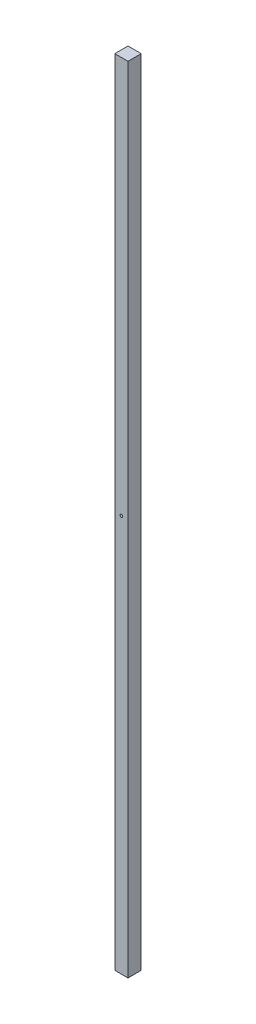
ISO-10303-21;
HEADER;
FILE_DESCRIPTION(('STEP AP214'),'2;1');
FILE_NAME('part.step','',(''),(''),'','','');
FILE_SCHEMA(('AUTOMOTIVE_DESIGN { 1 0 10303 214 1 1 1 1 }'));
ENDSEC;
DATA;
#1=APPLICATION_CONTEXT('core data for automotive mechanical design processes');
#2=APPLICATION_PROTOCOL_DEFINITION('international standard','automotive_design',2000,#1);
#3=PRODUCT_CONTEXT('',#1,'mechanical');
#4=PRODUCT('Part','Part','',(#3));
#5=PRODUCT_RELATED_PRODUCT_CATEGORY('part','',(#4));
#6=PRODUCT_DEFINITION_FORMATION('','',#4);
#7=PRODUCT_DEFINITION_CONTEXT('part definition',#1,'design');
#8=PRODUCT_DEFINITION('design','',#6,#7);
#9=PRODUCT_DEFINITION_SHAPE('','',#8);
#10=(LENGTH_UNIT() NAMED_UNIT(*) SI_UNIT(.MILLI.,.METRE.));
#11=(NAMED_UNIT(*) PLANE_ANGLE_UNIT() SI_UNIT($,.RADIAN.));
#12=(NAMED_UNIT(*) SI_UNIT($,.STERADIAN.) SOLID_ANGLE_UNIT());
#13=UNCERTAINTY_MEASURE_WITH_UNIT(LENGTH_MEASURE(1.E-05),#10,'distance_accuracy_value','');
#14=(GEOMETRIC_REPRESENTATION_CONTEXT(3) GLOBAL_UNCERTAINTY_ASSIGNED_CONTEXT((#13)) GLOBAL_UNIT_ASSIGNED_CONTEXT((#10,
#11,#12)) REPRESENTATION_CONTEXT('',''));
#15=CARTESIAN_POINT('',(0.,0.,0.));
#16=DIRECTION('',(0.,0.,1.));
#17=DIRECTION('',(1.,0.,0.));
#18=AXIS2_PLACEMENT_3D('',#15,#16,#17);
#19=CARTESIAN_POINT('',(-25.,3000.,-25.));
#20=DIRECTION('',(1.,0.,0.));
#21=DIRECTION('',(0.,0.,-1.));
#22=AXIS2_PLACEMENT_3D('',#19,#20,#21);
#23=PLANE('',#22);
#24=DIRECTION('',(0.,0.,1.));
#25=VECTOR('',#24,1.);
#26=CARTESIAN_POINT('',(-25.,0.,-25.));
#27=LINE('',#26,#25);
#28=CARTESIAN_POINT('',(-25.,0.,-25.));
#29=VERTEX_POINT('',#28);
#30=CARTESIAN_POINT('',(-25.,0.,25.));
#31=VERTEX_POINT('',#30);
#32=EDGE_CURVE('E110',#29,#31,#27,.T.);
#33=ORIENTED_EDGE('',*,*,#32,.T.);
#34=DIRECTION('',(0.,-1.,0.));
#35=VECTOR('',#34,1.);
#36=CARTESIAN_POINT('',(-25.,3000.,25.));
#37=LINE('',#36,#35);
#38=CARTESIAN_POINT('',(-25.,3000.,25.));
#39=VERTEX_POINT('',#38);
#40=EDGE_CURVE('E11',#39,#31,#37,.T.);
#41=ORIENTED_EDGE('',*,*,#40,.F.);
#42=DIRECTION('',(0.,0.,1.));
#43=VECTOR('',#42,1.);
#44=CARTESIAN_POINT('',(-25.,3000.,-25.));
#45=LINE('',#44,#43);
#46=CARTESIAN_POINT('',(-25.,3000.,-25.));
#47=VERTEX_POINT('',#46);
#48=EDGE_CURVE('E94',#47,#39,#45,.T.);
#49=ORIENTED_EDGE('',*,*,#48,.F.);
#50=DIRECTION('',(0.,-1.,0.));
#51=VECTOR('',#50,1.);
#52=CARTESIAN_POINT('',(-25.,3000.,-25.));
#53=LINE('',#52,#51);
#54=EDGE_CURVE('E106',#47,#29,#53,.T.);
#55=ORIENTED_EDGE('',*,*,#54,.T.);
#56=EDGE_LOOP('',(#33,#41,#49,#55));
#57=FACE_BOUND('',#56,.T.);
#58=ADVANCED_FACE('F42',(#57),#23,.F.);
#59=CARTESIAN_POINT('',(25.,3000.,25.));
#60=DIRECTION('',(0.,0.,-1.));
#61=DIRECTION('',(-1.,0.,0.));
#62=AXIS2_PLACEMENT_3D('',#59,#60,#61);
#63=PLANE('',#62);
#64=CARTESIAN_POINT('',(0.,1500.,25.));
#65=DIRECTION('',(0.,0.,1.));
#66=DIRECTION('',(1.,0.,0.));
#67=AXIS2_PLACEMENT_3D('',#64,#65,#66);
#68=CIRCLE('',#67,5.00000000000001);
#69=CARTESIAN_POINT('',(5.00000000000001,1500.,25.));
#70=VERTEX_POINT('',#69);
#71=EDGE_CURVE('E131',#70,#70,#68,.T.);
#72=ORIENTED_EDGE('',*,*,#71,.F.);
#73=EDGE_LOOP('',(#72));
#74=FACE_BOUND('',#73,.T.);
#75=DIRECTION('',(1.,0.,0.));
#76=VECTOR('',#75,1.);
#77=CARTESIAN_POINT('',(25.,0.,25.));
#78=LINE('',#77,#76);
#79=CARTESIAN_POINT('',(25.,0.,25.));
#80=VERTEX_POINT('',#79);
#81=EDGE_CURVE('E99',#31,#80,#78,.T.);
#82=ORIENTED_EDGE('',*,*,#81,.T.);
#83=DIRECTION('',(0.,-1.,0.));
#84=VECTOR('',#83,1.);
#85=CARTESIAN_POINT('',(25.,3000.,25.));
#86=LINE('',#85,#84);
#87=CARTESIAN_POINT('',(25.,3000.,25.));
#88=VERTEX_POINT('',#87);
#89=EDGE_CURVE('E51',#88,#80,#86,.T.);
#90=ORIENTED_EDGE('',*,*,#89,.F.);
#91=DIRECTION('',(1.,0.,0.));
#92=VECTOR('',#91,1.);
#93=CARTESIAN_POINT('',(25.,3000.,25.));
#94=LINE('',#93,#92);
#95=EDGE_CURVE('E89',#39,#88,#94,.T.);
#96=ORIENTED_EDGE('',*,*,#95,.F.);
#97=ORIENTED_EDGE('',*,*,#40,.T.);
#98=EDGE_LOOP('',(#82,#90,#96,#97));
#99=FACE_BOUND('',#98,.T.);
#100=ADVANCED_FACE('F98',(#74,#99),#63,.F.);
#101=CARTESIAN_POINT('',(25.,3000.,-25.));
#102=DIRECTION('',(-1.,0.,0.));
#103=DIRECTION('',(0.,0.,1.));
#104=AXIS2_PLACEMENT_3D('',#101,#102,#103);
#105=PLANE('',#104);
#106=DIRECTION('',(0.,0.,-1.));
#107=VECTOR('',#106,1.);
#108=CARTESIAN_POINT('',(25.,0.,-25.));
#109=LINE('',#108,#107);
#110=CARTESIAN_POINT('',(25.,0.,-25.));
#111=VERTEX_POINT('',#110);
#112=EDGE_CURVE('E76',#80,#111,#109,.T.);
#113=ORIENTED_EDGE('',*,*,#112,.T.);
#114=DIRECTION('',(0.,-1.,0.));
#115=VECTOR('',#114,1.);
#116=CARTESIAN_POINT('',(25.,3000.,-25.));
#117=LINE('',#116,#115);
#118=CARTESIAN_POINT('',(25.,3000.,-25.));
#119=VERTEX_POINT('',#118);
#120=EDGE_CURVE('E101',#119,#111,#117,.T.);
#121=ORIENTED_EDGE('',*,*,#120,.F.);
#122=DIRECTION('',(0.,0.,-1.));
#123=VECTOR('',#122,1.);
#124=CARTESIAN_POINT('',(25.,3000.,-25.));
#125=LINE('',#124,#123);
#126=EDGE_CURVE('E92',#88,#119,#125,.T.);
#127=ORIENTED_EDGE('',*,*,#126,.F.);
#128=ORIENTED_EDGE('',*,*,#89,.T.);
#129=EDGE_LOOP('',(#113,#121,#127,#128));
#130=FACE_BOUND('',#129,.T.);
#131=ADVANCED_FACE('F102',(#130),#105,.F.);
#132=CARTESIAN_POINT('',(25.,3000.,-25.));
#133=DIRECTION('',(0.,0.,1.));
#134=DIRECTION('',(1.,0.,0.));
#135=AXIS2_PLACEMENT_3D('',#132,#133,#134);
#136=PLANE('',#135);
#137=CARTESIAN_POINT('',(0.,1500.,-25.));
#138=DIRECTION('',(0.,0.,1.));
#139=DIRECTION('',(1.,0.,0.));
#140=AXIS2_PLACEMENT_3D('',#137,#138,#139);
#141=CIRCLE('',#140,5.00000000000001);
#142=CARTESIAN_POINT('',(5.00000000000001,1500.,-25.));
#143=VERTEX_POINT('',#142);
#144=EDGE_CURVE('E114',#143,#143,#141,.T.);
#145=ORIENTED_EDGE('',*,*,#144,.T.);
#146=EDGE_LOOP('',(#145));
#147=FACE_BOUND('',#146,.T.);
#148=DIRECTION('',(-1.,0.,0.));
#149=VECTOR('',#148,1.);
#150=CARTESIAN_POINT('',(25.,0.,-25.));
#151=LINE('',#150,#149);
#152=EDGE_CURVE('E82',#111,#29,#151,.T.);
#153=ORIENTED_EDGE('',*,*,#152,.T.);
#154=ORIENTED_EDGE('',*,*,#54,.F.);
#155=DIRECTION('',(-1.,0.,0.));
#156=VECTOR('',#155,1.);
#157=CARTESIAN_POINT('',(25.,3000.,-25.));
#158=LINE('',#157,#156);
#159=EDGE_CURVE('E59',#119,#47,#158,.T.);
#160=ORIENTED_EDGE('',*,*,#159,.F.);
#161=ORIENTED_EDGE('',*,*,#120,.T.);
#162=EDGE_LOOP('',(#153,#154,#160,#161));
#163=FACE_BOUND('',#162,.T.);
#164=ADVANCED_FACE('F124',(#147,#163),#136,.F.);
#165=CARTESIAN_POINT('',(0.,3000.,0.));
#166=DIRECTION('',(0.,-1.,0.));
#167=DIRECTION('',(0.,0.,-1.));
#168=AXIS2_PLACEMENT_3D('',#165,#166,#167);
#169=PLANE('',#168);
#170=ORIENTED_EDGE('',*,*,#48,.T.);
#171=ORIENTED_EDGE('',*,*,#95,.T.);
#172=ORIENTED_EDGE('',*,*,#126,.T.);
#173=ORIENTED_EDGE('',*,*,#159,.T.);
#174=EDGE_LOOP('',(#170,#171,#172,#173));
#175=FACE_BOUND('',#174,.T.);
#176=ADVANCED_FACE('F90',(#175),#169,.F.);
#177=CARTESIAN_POINT('',(0.,0.,0.));
#178=DIRECTION('',(0.,-1.,0.));
#179=DIRECTION('',(0.,0.,-1.));
#180=AXIS2_PLACEMENT_3D('',#177,#178,#179);
#181=PLANE('',#180);
#182=ORIENTED_EDGE('',*,*,#32,.F.);
#183=ORIENTED_EDGE('',*,*,#152,.F.);
#184=ORIENTED_EDGE('',*,*,#112,.F.);
#185=ORIENTED_EDGE('',*,*,#81,.F.);
#186=EDGE_LOOP('',(#182,#183,#184,#185));
#187=FACE_BOUND('',#186,.T.);
#188=ADVANCED_FACE('F127',(#187),#181,.T.);
#189=CARTESIAN_POINT('',(0.,1500.,-25.));
#190=DIRECTION('',(0.,0.,1.));
#191=DIRECTION('',(1.,0.,0.));
#192=AXIS2_PLACEMENT_3D('',#189,#190,#191);
#193=CYLINDRICAL_SURFACE('',#192,5.00000000000001);
#194=ORIENTED_EDGE('',*,*,#144,.F.);
#195=EDGE_LOOP('',(#194));
#196=FACE_BOUND('',#195,.T.);
#197=ORIENTED_EDGE('',*,*,#71,.T.);
#198=EDGE_LOOP('',(#197));
#199=FACE_BOUND('',#198,.T.);
#200=ADVANCED_FACE('F140',(#196,#199),#193,.F.);
#201=CLOSED_SHELL('',(#58,#100,#131,#164,#176,#188,#200));
#202=MANIFOLD_SOLID_BREP('B2',#201);
#203=ADVANCED_BREP_SHAPE_REPRESENTATION('',(#18,#202),#14);
#204=SHAPE_DEFINITION_REPRESENTATION(#9,#203);
ENDSEC;
END-ISO-10303-21;
